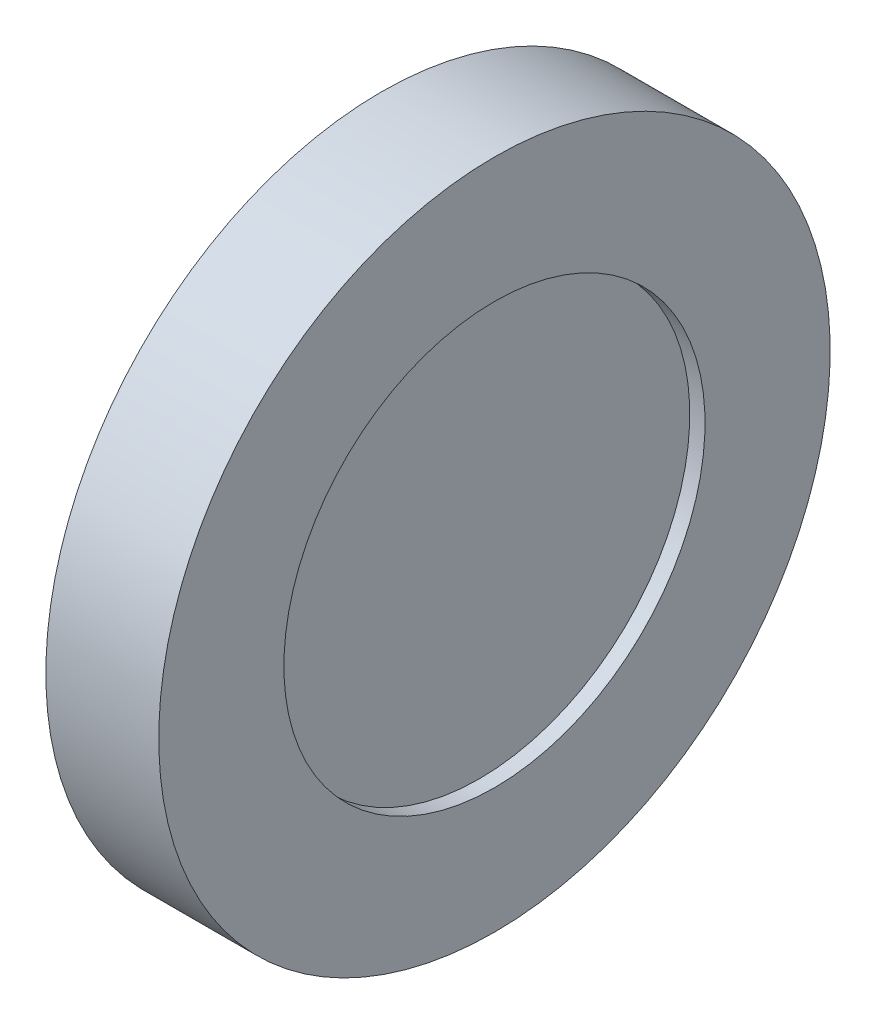
ISO-10303-21;
HEADER;
FILE_DESCRIPTION(('STEP AP214'),'2;1');
FILE_NAME('part.step','',(''),(''),'','','');
FILE_SCHEMA(('AUTOMOTIVE_DESIGN { 1 0 10303 214 1 1 1 1 }'));
ENDSEC;
DATA;
#1=APPLICATION_CONTEXT('core data for automotive mechanical design processes');
#2=APPLICATION_PROTOCOL_DEFINITION('international standard','automotive_design',2000,#1);
#3=PRODUCT_CONTEXT('',#1,'mechanical');
#4=PRODUCT('Part','Part','',(#3));
#5=PRODUCT_RELATED_PRODUCT_CATEGORY('part','',(#4));
#6=PRODUCT_DEFINITION_FORMATION('','',#4);
#7=PRODUCT_DEFINITION_CONTEXT('part definition',#1,'design');
#8=PRODUCT_DEFINITION('design','',#6,#7);
#9=PRODUCT_DEFINITION_SHAPE('','',#8);
#10=(LENGTH_UNIT() NAMED_UNIT(*) SI_UNIT(.MILLI.,.METRE.));
#11=(NAMED_UNIT(*) PLANE_ANGLE_UNIT() SI_UNIT($,.RADIAN.));
#12=(NAMED_UNIT(*) SI_UNIT($,.STERADIAN.) SOLID_ANGLE_UNIT());
#13=UNCERTAINTY_MEASURE_WITH_UNIT(LENGTH_MEASURE(1.E-05),#10,'distance_accuracy_value','');
#14=(GEOMETRIC_REPRESENTATION_CONTEXT(3) GLOBAL_UNCERTAINTY_ASSIGNED_CONTEXT((#13)) GLOBAL_UNIT_ASSIGNED_CONTEXT((#10,
#11,#12)) REPRESENTATION_CONTEXT('',''));
#15=CARTESIAN_POINT('',(0.,0.,0.));
#16=DIRECTION('',(0.,0.,1.));
#17=DIRECTION('',(1.,0.,0.));
#18=AXIS2_PLACEMENT_3D('',#15,#16,#17);
#19=CARTESIAN_POINT('',(1.35,0.,0.));
#20=DIRECTION('',(1.,0.,0.));
#21=DIRECTION('',(0.,1.,0.));
#22=AXIS2_PLACEMENT_3D('',#19,#20,#21);
#23=PLANE('',#22);
#24=CARTESIAN_POINT('',(1.35,0.,0.));
#25=DIRECTION('',(-1.,0.,0.));
#26=DIRECTION('',(0.,-1.,0.));
#27=AXIS2_PLACEMENT_3D('',#24,#25,#26);
#28=CIRCLE('',#27,6.9);
#29=CARTESIAN_POINT('',(1.35,-6.9,0.));
#30=VERTEX_POINT('',#29);
#31=EDGE_CURVE('E10',#30,#30,#28,.T.);
#32=ORIENTED_EDGE('',*,*,#31,.F.);
#33=EDGE_LOOP('',(#32));
#34=FACE_BOUND('',#33,.T.);
#35=ADVANCED_FACE('F33',(#34),#23,.T.);
#36=CARTESIAN_POINT('',(-1.85,0.,0.));
#37=DIRECTION('',(-1.,0.,0.));
#38=DIRECTION('',(0.,-1.,0.));
#39=AXIS2_PLACEMENT_3D('',#36,#37,#38);
#40=CYLINDRICAL_SURFACE('',#39,6.9);
#41=ORIENTED_EDGE('',*,*,#31,.T.);
#42=EDGE_LOOP('',(#41));
#43=FACE_BOUND('',#42,.T.);
#44=CARTESIAN_POINT('',(1.85,0.,0.));
#45=DIRECTION('',(-1.,0.,0.));
#46=DIRECTION('',(0.,-1.,0.));
#47=AXIS2_PLACEMENT_3D('',#44,#45,#46);
#48=CIRCLE('',#47,6.9);
#49=CARTESIAN_POINT('',(1.85,-6.9,0.));
#50=VERTEX_POINT('',#49);
#51=EDGE_CURVE('E39',#50,#50,#48,.T.);
#52=ORIENTED_EDGE('',*,*,#51,.F.);
#53=EDGE_LOOP('',(#52));
#54=FACE_BOUND('',#53,.T.);
#55=ADVANCED_FACE('F79',(#43,#54),#40,.F.);
#56=CARTESIAN_POINT('',(1.85,0.,0.));
#57=DIRECTION('',(-1.,0.,0.));
#58=DIRECTION('',(0.,-1.,0.));
#59=AXIS2_PLACEMENT_3D('',#56,#57,#58);
#60=PLANE('',#59);
#61=CARTESIAN_POINT('',(1.85,0.,0.));
#62=DIRECTION('',(-1.,0.,0.));
#63=DIRECTION('',(0.,-1.,0.));
#64=AXIS2_PLACEMENT_3D('',#61,#62,#63);
#65=CIRCLE('',#64,11.);
#66=CARTESIAN_POINT('',(1.85,-11.,0.));
#67=VERTEX_POINT('',#66);
#68=EDGE_CURVE('E43',#67,#67,#65,.T.);
#69=ORIENTED_EDGE('',*,*,#68,.F.);
#70=EDGE_LOOP('',(#69));
#71=FACE_BOUND('',#70,.T.);
#72=ORIENTED_EDGE('',*,*,#51,.T.);
#73=EDGE_LOOP('',(#72));
#74=FACE_BOUND('',#73,.T.);
#75=ADVANCED_FACE('F75',(#71,#74),#60,.F.);
#76=CARTESIAN_POINT('',(-1.85,0.,0.));
#77=DIRECTION('',(-1.,0.,0.));
#78=DIRECTION('',(0.,-1.,0.));
#79=AXIS2_PLACEMENT_3D('',#76,#77,#78);
#80=CYLINDRICAL_SURFACE('',#79,11.);
#81=ORIENTED_EDGE('',*,*,#68,.T.);
#82=EDGE_LOOP('',(#81));
#83=FACE_BOUND('',#82,.T.);
#84=CARTESIAN_POINT('',(-1.85,0.,0.));
#85=DIRECTION('',(-1.,0.,0.));
#86=DIRECTION('',(0.,-1.,0.));
#87=AXIS2_PLACEMENT_3D('',#84,#85,#86);
#88=CIRCLE('',#87,11.);
#89=CARTESIAN_POINT('',(-1.85,-11.,0.));
#90=VERTEX_POINT('',#89);
#91=EDGE_CURVE('E47',#90,#90,#88,.T.);
#92=ORIENTED_EDGE('',*,*,#91,.F.);
#93=EDGE_LOOP('',(#92));
#94=FACE_BOUND('',#93,.T.);
#95=ADVANCED_FACE('F69',(#83,#94),#80,.T.);
#96=CARTESIAN_POINT('',(-1.85,0.,0.));
#97=DIRECTION('',(-1.,0.,0.));
#98=DIRECTION('',(0.,-1.,0.));
#99=AXIS2_PLACEMENT_3D('',#96,#97,#98);
#100=PLANE('',#99);
#101=ORIENTED_EDGE('',*,*,#91,.T.);
#102=EDGE_LOOP('',(#101));
#103=FACE_BOUND('',#102,.T.);
#104=CARTESIAN_POINT('',(-1.85,0.,0.));
#105=DIRECTION('',(-1.,0.,0.));
#106=DIRECTION('',(0.,-1.,0.));
#107=AXIS2_PLACEMENT_3D('',#104,#105,#106);
#108=CIRCLE('',#107,6.9);
#109=CARTESIAN_POINT('',(-1.85,-6.9,0.));
#110=VERTEX_POINT('',#109);
#111=EDGE_CURVE('E52',#110,#110,#108,.T.);
#112=ORIENTED_EDGE('',*,*,#111,.F.);
#113=EDGE_LOOP('',(#112));
#114=FACE_BOUND('',#113,.T.);
#115=ADVANCED_FACE('F64',(#103,#114),#100,.T.);
#116=CARTESIAN_POINT('',(-1.85,0.,0.));
#117=DIRECTION('',(-1.,0.,0.));
#118=DIRECTION('',(0.,-1.,0.));
#119=AXIS2_PLACEMENT_3D('',#116,#117,#118);
#120=CYLINDRICAL_SURFACE('',#119,6.9);
#121=CARTESIAN_POINT('',(-1.35,0.,0.));
#122=DIRECTION('',(-1.,0.,0.));
#123=DIRECTION('',(0.,-1.,0.));
#124=AXIS2_PLACEMENT_3D('',#121,#122,#123);
#125=CIRCLE('',#124,6.9);
#126=CARTESIAN_POINT('',(-1.35,-6.9,0.));
#127=VERTEX_POINT('',#126);
#128=EDGE_CURVE('E55',#127,#127,#125,.T.);
#129=ORIENTED_EDGE('',*,*,#128,.F.);
#130=EDGE_LOOP('',(#129));
#131=FACE_BOUND('',#130,.T.);
#132=ORIENTED_EDGE('',*,*,#111,.T.);
#133=EDGE_LOOP('',(#132));
#134=FACE_BOUND('',#133,.T.);
#135=ADVANCED_FACE('F61',(#131,#134),#120,.F.);
#136=CARTESIAN_POINT('',(-1.35,0.,0.));
#137=DIRECTION('',(1.,0.,0.));
#138=DIRECTION('',(0.,1.,0.));
#139=AXIS2_PLACEMENT_3D('',#136,#137,#138);
#140=PLANE('',#139);
#141=ORIENTED_EDGE('',*,*,#128,.T.);
#142=EDGE_LOOP('',(#141));
#143=FACE_BOUND('',#142,.T.);
#144=ADVANCED_FACE('F59',(#143),#140,.F.);
#145=CLOSED_SHELL('',(#35,#55,#75,#95,#115,#135,#144));
#146=MANIFOLD_SOLID_BREP('B2',#145);
#147=ADVANCED_BREP_SHAPE_REPRESENTATION('',(#18,#146),#14);
#148=SHAPE_DEFINITION_REPRESENTATION(#9,#147);
ENDSEC;
END-ISO-10303-21;
